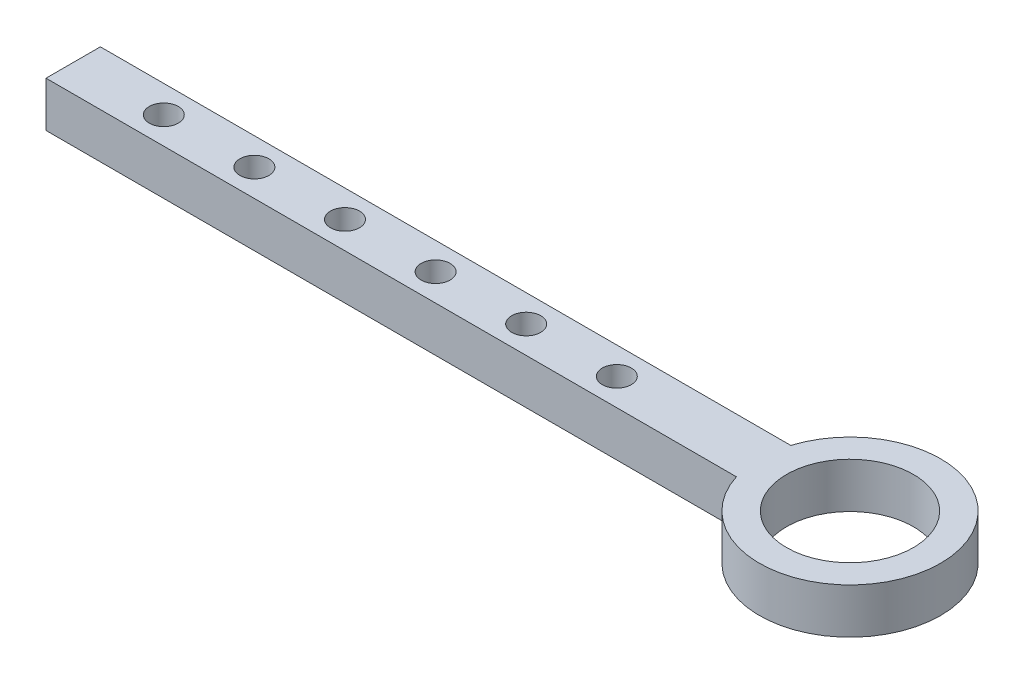
ISO-10303-21;
HEADER;
FILE_DESCRIPTION(('STEP AP214'),'2;1');
FILE_NAME('part.step','',(''),(''),'','','');
FILE_SCHEMA(('AUTOMOTIVE_DESIGN { 1 0 10303 214 1 1 1 1 }'));
ENDSEC;
DATA;
#1=APPLICATION_CONTEXT('core data for automotive mechanical design processes');
#2=APPLICATION_PROTOCOL_DEFINITION('international standard','automotive_design',2000,#1);
#3=PRODUCT_CONTEXT('',#1,'mechanical');
#4=PRODUCT('Part','Part','',(#3));
#5=PRODUCT_RELATED_PRODUCT_CATEGORY('part','',(#4));
#6=PRODUCT_DEFINITION_FORMATION('','',#4);
#7=PRODUCT_DEFINITION_CONTEXT('part definition',#1,'design');
#8=PRODUCT_DEFINITION('design','',#6,#7);
#9=PRODUCT_DEFINITION_SHAPE('','',#8);
#10=(LENGTH_UNIT() NAMED_UNIT(*) SI_UNIT(.MILLI.,.METRE.));
#11=(NAMED_UNIT(*) PLANE_ANGLE_UNIT() SI_UNIT($,.RADIAN.));
#12=(NAMED_UNIT(*) SI_UNIT($,.STERADIAN.) SOLID_ANGLE_UNIT());
#13=UNCERTAINTY_MEASURE_WITH_UNIT(LENGTH_MEASURE(1.E-05),#10,'distance_accuracy_value','');
#14=(GEOMETRIC_REPRESENTATION_CONTEXT(3) GLOBAL_UNCERTAINTY_ASSIGNED_CONTEXT((#13)) GLOBAL_UNIT_ASSIGNED_CONTEXT((#10,
#11,#12)) REPRESENTATION_CONTEXT('',''));
#15=CARTESIAN_POINT('',(0.,0.,0.));
#16=DIRECTION('',(0.,0.,1.));
#17=DIRECTION('',(1.,0.,0.));
#18=AXIS2_PLACEMENT_3D('',#15,#16,#17);
#19=CARTESIAN_POINT('',(85.7393920141695,5.,-3.));
#20=DIRECTION('',(0.,-1.,0.));
#21=DIRECTION('',(0.,0.,-1.));
#22=AXIS2_PLACEMENT_3D('',#19,#20,#21);
#23=CYLINDRICAL_SURFACE('',#22,9.99999999999999);
#24=CARTESIAN_POINT('',(85.7393920141695,0.,-3.));
#25=DIRECTION('',(0.,1.,0.));
#26=DIRECTION('',(0.,0.,1.));
#27=AXIS2_PLACEMENT_3D('',#24,#25,#26);
#28=CIRCLE('',#27,9.99999999999999);
#29=CARTESIAN_POINT('',(76.2,0.,0.));
#30=VERTEX_POINT('',#29);
#31=CARTESIAN_POINT('',(76.2,0.,-6.));
#32=VERTEX_POINT('',#31);
#33=EDGE_CURVE('E118',#30,#32,#28,.T.);
#34=ORIENTED_EDGE('',*,*,#33,.T.);
#35=DIRECTION('',(0.,-1.,0.));
#36=VECTOR('',#35,1.);
#37=CARTESIAN_POINT('',(76.2,5.,-6.));
#38=LINE('',#37,#36);
#39=CARTESIAN_POINT('',(76.2,5.,-6.));
#40=VERTEX_POINT('',#39);
#41=EDGE_CURVE('E11',#40,#32,#38,.T.);
#42=ORIENTED_EDGE('',*,*,#41,.F.);
#43=CARTESIAN_POINT('',(85.7393920141695,5.,-3.));
#44=DIRECTION('',(0.,1.,0.));
#45=DIRECTION('',(0.,0.,1.));
#46=AXIS2_PLACEMENT_3D('',#43,#44,#45);
#47=CIRCLE('',#46,9.99999999999999);
#48=CARTESIAN_POINT('',(76.2,5.,0.));
#49=VERTEX_POINT('',#48);
#50=EDGE_CURVE('E74',#49,#40,#47,.T.);
#51=ORIENTED_EDGE('',*,*,#50,.F.);
#52=DIRECTION('',(0.,-1.,0.));
#53=VECTOR('',#52,1.);
#54=CARTESIAN_POINT('',(76.2,5.,0.));
#55=LINE('',#54,#53);
#56=EDGE_CURVE('E93',#49,#30,#55,.T.);
#57=ORIENTED_EDGE('',*,*,#56,.T.);
#58=EDGE_LOOP('',(#34,#42,#51,#57));
#59=FACE_BOUND('',#58,.T.);
#60=ADVANCED_FACE('F34',(#59),#23,.T.);
#61=CARTESIAN_POINT('',(0.,5.,-6.));
#62=DIRECTION('',(0.,0.,-1.));
#63=DIRECTION('',(-1.,0.,0.));
#64=AXIS2_PLACEMENT_3D('',#61,#62,#63);
#65=PLANE('',#64);
#66=DIRECTION('',(1.,0.,0.));
#67=VECTOR('',#66,1.);
#68=CARTESIAN_POINT('',(0.,0.,-6.));
#69=LINE('',#68,#67);
#70=CARTESIAN_POINT('',(0.,0.,-6.));
#71=VERTEX_POINT('',#70);
#72=EDGE_CURVE('E83',#71,#32,#69,.T.);
#73=ORIENTED_EDGE('',*,*,#72,.F.);
#74=DIRECTION('',(0.,-1.,0.));
#75=VECTOR('',#74,1.);
#76=CARTESIAN_POINT('',(0.,5.,-6.));
#77=LINE('',#76,#75);
#78=CARTESIAN_POINT('',(0.,5.,-6.));
#79=VERTEX_POINT('',#78);
#80=EDGE_CURVE('E43',#79,#71,#77,.T.);
#81=ORIENTED_EDGE('',*,*,#80,.F.);
#82=DIRECTION('',(1.,0.,0.));
#83=VECTOR('',#82,1.);
#84=CARTESIAN_POINT('',(0.,5.,-6.));
#85=LINE('',#84,#83);
#86=EDGE_CURVE('E81',#79,#40,#85,.T.);
#87=ORIENTED_EDGE('',*,*,#86,.T.);
#88=ORIENTED_EDGE('',*,*,#41,.T.);
#89=EDGE_LOOP('',(#73,#81,#87,#88));
#90=FACE_BOUND('',#89,.T.);
#91=ADVANCED_FACE('F80',(#90),#65,.T.);
#92=CARTESIAN_POINT('',(0.,5.,0.));
#93=DIRECTION('',(-1.,0.,0.));
#94=DIRECTION('',(0.,0.,1.));
#95=AXIS2_PLACEMENT_3D('',#92,#93,#94);
#96=PLANE('',#95);
#97=DIRECTION('',(0.,0.,-1.));
#98=VECTOR('',#97,1.);
#99=CARTESIAN_POINT('',(0.,0.,0.));
#100=LINE('',#99,#98);
#101=CARTESIAN_POINT('',(0.,0.,0.));
#102=VERTEX_POINT('',#101);
#103=EDGE_CURVE('E122',#102,#71,#100,.T.);
#104=ORIENTED_EDGE('',*,*,#103,.F.);
#105=DIRECTION('',(0.,-1.,0.));
#106=VECTOR('',#105,1.);
#107=CARTESIAN_POINT('',(0.,5.,0.));
#108=LINE('',#107,#106);
#109=CARTESIAN_POINT('',(0.,5.,0.));
#110=VERTEX_POINT('',#109);
#111=EDGE_CURVE('E66',#110,#102,#108,.T.);
#112=ORIENTED_EDGE('',*,*,#111,.F.);
#113=DIRECTION('',(0.,0.,-1.));
#114=VECTOR('',#113,1.);
#115=CARTESIAN_POINT('',(0.,5.,0.));
#116=LINE('',#115,#114);
#117=EDGE_CURVE('E89',#110,#79,#116,.T.);
#118=ORIENTED_EDGE('',*,*,#117,.T.);
#119=ORIENTED_EDGE('',*,*,#80,.T.);
#120=EDGE_LOOP('',(#104,#112,#118,#119));
#121=FACE_BOUND('',#120,.T.);
#122=ADVANCED_FACE('F91',(#121),#96,.T.);
#123=CARTESIAN_POINT('',(85.7393920141695,5.,-3.));
#124=DIRECTION('',(0.,-1.,0.));
#125=DIRECTION('',(0.,0.,-1.));
#126=AXIS2_PLACEMENT_3D('',#123,#124,#125);
#127=CYLINDRICAL_SURFACE('',#126,7.);
#128=CARTESIAN_POINT('',(85.7393920141695,5.,-3.));
#129=DIRECTION('',(0.,1.,0.));
#130=DIRECTION('',(0.,0.,1.));
#131=AXIS2_PLACEMENT_3D('',#128,#129,#130);
#132=CIRCLE('',#131,7.);
#133=CARTESIAN_POINT('',(85.7393920141695,5.,4.));
#134=VERTEX_POINT('',#133);
#135=EDGE_CURVE('E213',#134,#134,#132,.T.);
#136=ORIENTED_EDGE('',*,*,#135,.T.);
#137=EDGE_LOOP('',(#136));
#138=FACE_BOUND('',#137,.T.);
#139=CARTESIAN_POINT('',(85.7393920141695,0.,-3.));
#140=DIRECTION('',(0.,1.,0.));
#141=DIRECTION('',(0.,0.,1.));
#142=AXIS2_PLACEMENT_3D('',#139,#140,#141);
#143=CIRCLE('',#142,7.);
#144=CARTESIAN_POINT('',(85.7393920141695,0.,4.));
#145=VERTEX_POINT('',#144);
#146=EDGE_CURVE('E115',#145,#145,#143,.T.);
#147=ORIENTED_EDGE('',*,*,#146,.F.);
#148=EDGE_LOOP('',(#147));
#149=FACE_BOUND('',#148,.T.);
#150=ADVANCED_FACE('F150',(#138,#149),#127,.F.);
#151=CARTESIAN_POINT('',(10.,5.,-3.));
#152=DIRECTION('',(0.,-1.,0.));
#153=DIRECTION('',(0.,0.,-1.));
#154=AXIS2_PLACEMENT_3D('',#151,#152,#153);
#155=CYLINDRICAL_SURFACE('',#154,1.6);
#156=CARTESIAN_POINT('',(10.,5.,-3.));
#157=DIRECTION('',(0.,1.,0.));
#158=DIRECTION('',(0.,0.,1.));
#159=AXIS2_PLACEMENT_3D('',#156,#157,#158);
#160=CIRCLE('',#159,1.6);
#161=CARTESIAN_POINT('',(10.,5.,-1.4));
#162=VERTEX_POINT('',#161);
#163=EDGE_CURVE('E210',#162,#162,#160,.T.);
#164=ORIENTED_EDGE('',*,*,#163,.T.);
#165=EDGE_LOOP('',(#164));
#166=FACE_BOUND('',#165,.T.);
#167=CARTESIAN_POINT('',(10.,0.,-3.));
#168=DIRECTION('',(0.,1.,0.));
#169=DIRECTION('',(0.,0.,1.));
#170=AXIS2_PLACEMENT_3D('',#167,#168,#169);
#171=CIRCLE('',#170,1.6);
#172=CARTESIAN_POINT('',(10.,0.,-1.4));
#173=VERTEX_POINT('',#172);
#174=EDGE_CURVE('E112',#173,#173,#171,.T.);
#175=ORIENTED_EDGE('',*,*,#174,.F.);
#176=EDGE_LOOP('',(#175));
#177=FACE_BOUND('',#176,.T.);
#178=ADVANCED_FACE('F153',(#166,#177),#155,.F.);
#179=CARTESIAN_POINT('',(20.,5.,-3.));
#180=DIRECTION('',(0.,-1.,0.));
#181=DIRECTION('',(0.,0.,-1.));
#182=AXIS2_PLACEMENT_3D('',#179,#180,#181);
#183=CYLINDRICAL_SURFACE('',#182,1.6);
#184=CARTESIAN_POINT('',(20.,5.,-3.));
#185=DIRECTION('',(0.,1.,0.));
#186=DIRECTION('',(0.,0.,1.));
#187=AXIS2_PLACEMENT_3D('',#184,#185,#186);
#188=CIRCLE('',#187,1.6);
#189=CARTESIAN_POINT('',(20.,5.,-1.4));
#190=VERTEX_POINT('',#189);
#191=EDGE_CURVE('E207',#190,#190,#188,.T.);
#192=ORIENTED_EDGE('',*,*,#191,.T.);
#193=EDGE_LOOP('',(#192));
#194=FACE_BOUND('',#193,.T.);
#195=CARTESIAN_POINT('',(20.,0.,-3.));
#196=DIRECTION('',(0.,1.,0.));
#197=DIRECTION('',(0.,0.,1.));
#198=AXIS2_PLACEMENT_3D('',#195,#196,#197);
#199=CIRCLE('',#198,1.6);
#200=CARTESIAN_POINT('',(20.,0.,-1.4));
#201=VERTEX_POINT('',#200);
#202=EDGE_CURVE('E109',#201,#201,#199,.T.);
#203=ORIENTED_EDGE('',*,*,#202,.F.);
#204=EDGE_LOOP('',(#203));
#205=FACE_BOUND('',#204,.T.);
#206=ADVANCED_FACE('F157',(#194,#205),#183,.F.);
#207=CARTESIAN_POINT('',(30.,5.,-3.));
#208=DIRECTION('',(0.,-1.,0.));
#209=DIRECTION('',(0.,0.,-1.));
#210=AXIS2_PLACEMENT_3D('',#207,#208,#209);
#211=CYLINDRICAL_SURFACE('',#210,1.6);
#212=CARTESIAN_POINT('',(30.,5.,-3.));
#213=DIRECTION('',(0.,1.,0.));
#214=DIRECTION('',(0.,0.,1.));
#215=AXIS2_PLACEMENT_3D('',#212,#213,#214);
#216=CIRCLE('',#215,1.6);
#217=CARTESIAN_POINT('',(30.,5.,-1.4));
#218=VERTEX_POINT('',#217);
#219=EDGE_CURVE('E200',#218,#218,#216,.T.);
#220=ORIENTED_EDGE('',*,*,#219,.T.);
#221=EDGE_LOOP('',(#220));
#222=FACE_BOUND('',#221,.T.);
#223=CARTESIAN_POINT('',(30.,0.,-3.));
#224=DIRECTION('',(0.,1.,0.));
#225=DIRECTION('',(0.,0.,1.));
#226=AXIS2_PLACEMENT_3D('',#223,#224,#225);
#227=CIRCLE('',#226,1.6);
#228=CARTESIAN_POINT('',(30.,0.,-1.4));
#229=VERTEX_POINT('',#228);
#230=EDGE_CURVE('E106',#229,#229,#227,.T.);
#231=ORIENTED_EDGE('',*,*,#230,.F.);
#232=EDGE_LOOP('',(#231));
#233=FACE_BOUND('',#232,.T.);
#234=ADVANCED_FACE('F161',(#222,#233),#211,.F.);
#235=CARTESIAN_POINT('',(40.,5.,-3.));
#236=DIRECTION('',(0.,-1.,0.));
#237=DIRECTION('',(0.,0.,-1.));
#238=AXIS2_PLACEMENT_3D('',#235,#236,#237);
#239=CYLINDRICAL_SURFACE('',#238,1.6);
#240=CARTESIAN_POINT('',(40.,5.,-3.));
#241=DIRECTION('',(0.,1.,0.));
#242=DIRECTION('',(0.,0.,1.));
#243=AXIS2_PLACEMENT_3D('',#240,#241,#242);
#244=CIRCLE('',#243,1.6);
#245=CARTESIAN_POINT('',(40.,5.,-1.4));
#246=VERTEX_POINT('',#245);
#247=EDGE_CURVE('E197',#246,#246,#244,.T.);
#248=ORIENTED_EDGE('',*,*,#247,.T.);
#249=EDGE_LOOP('',(#248));
#250=FACE_BOUND('',#249,.T.);
#251=CARTESIAN_POINT('',(40.,0.,-3.));
#252=DIRECTION('',(0.,1.,0.));
#253=DIRECTION('',(0.,0.,1.));
#254=AXIS2_PLACEMENT_3D('',#251,#252,#253);
#255=CIRCLE('',#254,1.6);
#256=CARTESIAN_POINT('',(40.,0.,-1.4));
#257=VERTEX_POINT('',#256);
#258=EDGE_CURVE('E103',#257,#257,#255,.T.);
#259=ORIENTED_EDGE('',*,*,#258,.F.);
#260=EDGE_LOOP('',(#259));
#261=FACE_BOUND('',#260,.T.);
#262=ADVANCED_FACE('F165',(#250,#261),#239,.F.);
#263=CARTESIAN_POINT('',(50.,5.,-3.));
#264=DIRECTION('',(0.,-1.,0.));
#265=DIRECTION('',(0.,0.,-1.));
#266=AXIS2_PLACEMENT_3D('',#263,#264,#265);
#267=CYLINDRICAL_SURFACE('',#266,1.6);
#268=CARTESIAN_POINT('',(50.,5.,-3.));
#269=DIRECTION('',(0.,1.,0.));
#270=DIRECTION('',(0.,0.,1.));
#271=AXIS2_PLACEMENT_3D('',#268,#269,#270);
#272=CIRCLE('',#271,1.6);
#273=CARTESIAN_POINT('',(50.,5.,-1.4));
#274=VERTEX_POINT('',#273);
#275=EDGE_CURVE('E179',#274,#274,#272,.T.);
#276=ORIENTED_EDGE('',*,*,#275,.T.);
#277=EDGE_LOOP('',(#276));
#278=FACE_BOUND('',#277,.T.);
#279=CARTESIAN_POINT('',(50.,0.,-3.));
#280=DIRECTION('',(0.,1.,0.));
#281=DIRECTION('',(0.,0.,1.));
#282=AXIS2_PLACEMENT_3D('',#279,#280,#281);
#283=CIRCLE('',#282,1.6);
#284=CARTESIAN_POINT('',(50.,0.,-1.4));
#285=VERTEX_POINT('',#284);
#286=EDGE_CURVE('E100',#285,#285,#283,.T.);
#287=ORIENTED_EDGE('',*,*,#286,.F.);
#288=EDGE_LOOP('',(#287));
#289=FACE_BOUND('',#288,.T.);
#290=ADVANCED_FACE('F168',(#278,#289),#267,.F.);
#291=CARTESIAN_POINT('',(60.,5.,-3.));
#292=DIRECTION('',(0.,-1.,0.));
#293=DIRECTION('',(0.,0.,-1.));
#294=AXIS2_PLACEMENT_3D('',#291,#292,#293);
#295=CYLINDRICAL_SURFACE('',#294,1.6);
#296=CARTESIAN_POINT('',(60.,5.,-3.));
#297=DIRECTION('',(0.,1.,0.));
#298=DIRECTION('',(0.,0.,1.));
#299=AXIS2_PLACEMENT_3D('',#296,#297,#298);
#300=CIRCLE('',#299,1.6);
#301=CARTESIAN_POINT('',(60.,5.,-1.4));
#302=VERTEX_POINT('',#301);
#303=EDGE_CURVE('E125',#302,#302,#300,.T.);
#304=ORIENTED_EDGE('',*,*,#303,.T.);
#305=EDGE_LOOP('',(#304));
#306=FACE_BOUND('',#305,.T.);
#307=CARTESIAN_POINT('',(60.,0.,-3.));
#308=DIRECTION('',(0.,1.,0.));
#309=DIRECTION('',(0.,0.,1.));
#310=AXIS2_PLACEMENT_3D('',#307,#308,#309);
#311=CIRCLE('',#310,1.6);
#312=CARTESIAN_POINT('',(60.,0.,-1.4));
#313=VERTEX_POINT('',#312);
#314=EDGE_CURVE('E97',#313,#313,#311,.T.);
#315=ORIENTED_EDGE('',*,*,#314,.F.);
#316=EDGE_LOOP('',(#315));
#317=FACE_BOUND('',#316,.T.);
#318=ADVANCED_FACE('F36',(#306,#317),#295,.F.);
#319=CARTESIAN_POINT('',(0.,5.,0.));
#320=DIRECTION('',(0.,0.,-1.));
#321=DIRECTION('',(-1.,0.,0.));
#322=AXIS2_PLACEMENT_3D('',#319,#320,#321);
#323=PLANE('',#322);
#324=DIRECTION('',(1.,0.,0.));
#325=VECTOR('',#324,1.);
#326=CARTESIAN_POINT('',(0.,0.,0.));
#327=LINE('',#326,#325);
#328=EDGE_CURVE('E69',#102,#30,#327,.T.);
#329=ORIENTED_EDGE('',*,*,#328,.T.);
#330=ORIENTED_EDGE('',*,*,#56,.F.);
#331=DIRECTION('',(1.,0.,0.));
#332=VECTOR('',#331,1.);
#333=CARTESIAN_POINT('',(0.,5.,0.));
#334=LINE('',#333,#332);
#335=EDGE_CURVE('E51',#110,#49,#334,.T.);
#336=ORIENTED_EDGE('',*,*,#335,.F.);
#337=ORIENTED_EDGE('',*,*,#111,.T.);
#338=EDGE_LOOP('',(#329,#330,#336,#337));
#339=FACE_BOUND('',#338,.T.);
#340=ADVANCED_FACE('F137',(#339),#323,.F.);
#341=CARTESIAN_POINT('',(0.,5.,0.));
#342=DIRECTION('',(0.,1.,0.));
#343=DIRECTION('',(0.,0.,1.));
#344=AXIS2_PLACEMENT_3D('',#341,#342,#343);
#345=PLANE('',#344);
#346=ORIENTED_EDGE('',*,*,#303,.F.);
#347=EDGE_LOOP('',(#346));
#348=FACE_BOUND('',#347,.T.);
#349=ORIENTED_EDGE('',*,*,#275,.F.);
#350=EDGE_LOOP('',(#349));
#351=FACE_BOUND('',#350,.T.);
#352=ORIENTED_EDGE('',*,*,#247,.F.);
#353=EDGE_LOOP('',(#352));
#354=FACE_BOUND('',#353,.T.);
#355=ORIENTED_EDGE('',*,*,#219,.F.);
#356=EDGE_LOOP('',(#355));
#357=FACE_BOUND('',#356,.T.);
#358=ORIENTED_EDGE('',*,*,#191,.F.);
#359=EDGE_LOOP('',(#358));
#360=FACE_BOUND('',#359,.T.);
#361=ORIENTED_EDGE('',*,*,#163,.F.);
#362=EDGE_LOOP('',(#361));
#363=FACE_BOUND('',#362,.T.);
#364=ORIENTED_EDGE('',*,*,#135,.F.);
#365=EDGE_LOOP('',(#364));
#366=FACE_BOUND('',#365,.T.);
#367=ORIENTED_EDGE('',*,*,#50,.T.);
#368=ORIENTED_EDGE('',*,*,#86,.F.);
#369=ORIENTED_EDGE('',*,*,#117,.F.);
#370=ORIENTED_EDGE('',*,*,#335,.T.);
#371=EDGE_LOOP('',(#367,#368,#369,#370));
#372=FACE_BOUND('',#371,.T.);
#373=ADVANCED_FACE('F88',(#348,#351,#354,#357,#360,#363,#366,#372),#345,.T.);
#374=CARTESIAN_POINT('',(0.,0.,0.));
#375=DIRECTION('',(0.,1.,0.));
#376=DIRECTION('',(0.,0.,1.));
#377=AXIS2_PLACEMENT_3D('',#374,#375,#376);
#378=PLANE('',#377);
#379=ORIENTED_EDGE('',*,*,#314,.T.);
#380=EDGE_LOOP('',(#379));
#381=FACE_BOUND('',#380,.T.);
#382=ORIENTED_EDGE('',*,*,#286,.T.);
#383=EDGE_LOOP('',(#382));
#384=FACE_BOUND('',#383,.T.);
#385=ORIENTED_EDGE('',*,*,#258,.T.);
#386=EDGE_LOOP('',(#385));
#387=FACE_BOUND('',#386,.T.);
#388=ORIENTED_EDGE('',*,*,#230,.T.);
#389=EDGE_LOOP('',(#388));
#390=FACE_BOUND('',#389,.T.);
#391=ORIENTED_EDGE('',*,*,#202,.T.);
#392=EDGE_LOOP('',(#391));
#393=FACE_BOUND('',#392,.T.);
#394=ORIENTED_EDGE('',*,*,#174,.T.);
#395=EDGE_LOOP('',(#394));
#396=FACE_BOUND('',#395,.T.);
#397=ORIENTED_EDGE('',*,*,#146,.T.);
#398=EDGE_LOOP('',(#397));
#399=FACE_BOUND('',#398,.T.);
#400=ORIENTED_EDGE('',*,*,#33,.F.);
#401=ORIENTED_EDGE('',*,*,#328,.F.);
#402=ORIENTED_EDGE('',*,*,#103,.T.);
#403=ORIENTED_EDGE('',*,*,#72,.T.);
#404=EDGE_LOOP('',(#400,#401,#402,#403));
#405=FACE_BOUND('',#404,.T.);
#406=ADVANCED_FACE('F130',(#381,#384,#387,#390,#393,#396,#399,#405),#378,.F.);
#407=CLOSED_SHELL('',(#60,#91,#122,#150,#178,#206,#234,#262,#290,#318,#340,#373,#406));
#408=MANIFOLD_SOLID_BREP('B2',#407);
#409=ADVANCED_BREP_SHAPE_REPRESENTATION('',(#18,#408),#14);
#410=SHAPE_DEFINITION_REPRESENTATION(#9,#409);
ENDSEC;
END-ISO-10303-21;
